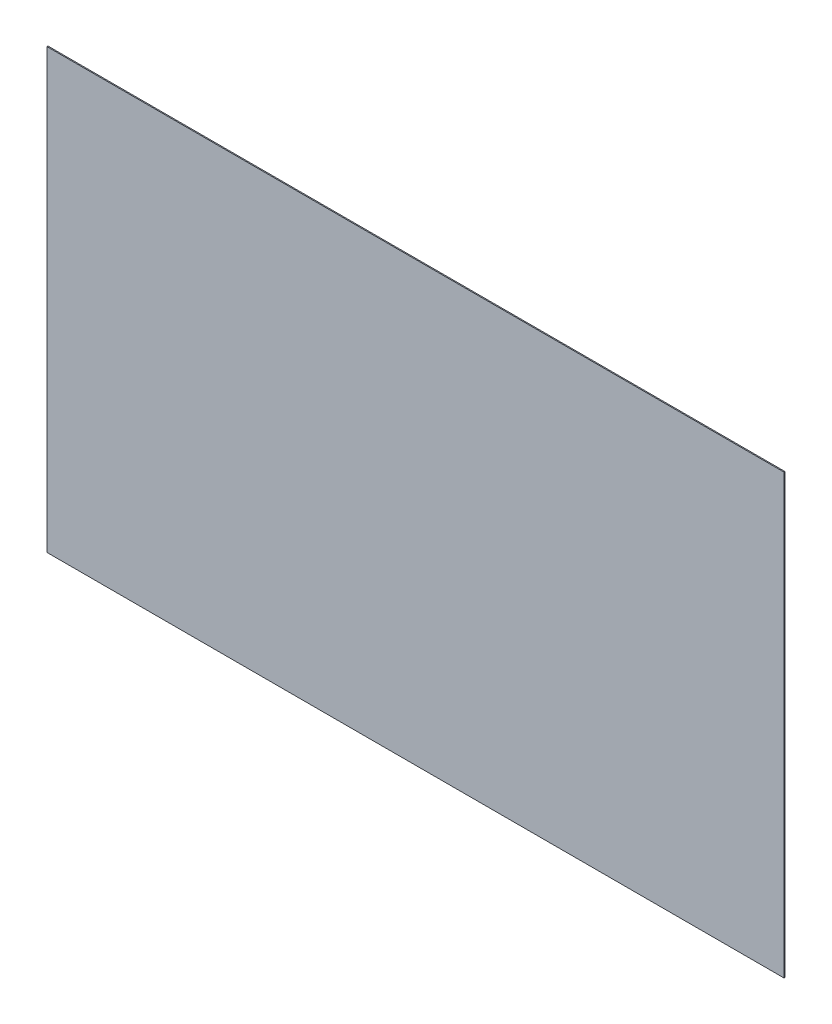
ISO-10303-21;
HEADER;
FILE_DESCRIPTION(('STEP AP214'),'2;1');
FILE_NAME('part.step','',(''),(''),'','','');
FILE_SCHEMA(('AUTOMOTIVE_DESIGN { 1 0 10303 214 1 1 1 1 }'));
ENDSEC;
DATA;
#1=APPLICATION_CONTEXT('core data for automotive mechanical design processes');
#2=APPLICATION_PROTOCOL_DEFINITION('international standard','automotive_design',2000,#1);
#3=PRODUCT_CONTEXT('',#1,'mechanical');
#4=PRODUCT('Part','Part','',(#3));
#5=PRODUCT_RELATED_PRODUCT_CATEGORY('part','',(#4));
#6=PRODUCT_DEFINITION_FORMATION('','',#4);
#7=PRODUCT_DEFINITION_CONTEXT('part definition',#1,'design');
#8=PRODUCT_DEFINITION('design','',#6,#7);
#9=PRODUCT_DEFINITION_SHAPE('','',#8);
#10=(LENGTH_UNIT() NAMED_UNIT(*) SI_UNIT(.MILLI.,.METRE.));
#11=(NAMED_UNIT(*) PLANE_ANGLE_UNIT() SI_UNIT($,.RADIAN.));
#12=(NAMED_UNIT(*) SI_UNIT($,.STERADIAN.) SOLID_ANGLE_UNIT());
#13=UNCERTAINTY_MEASURE_WITH_UNIT(LENGTH_MEASURE(1.E-05),#10,'distance_accuracy_value','');
#14=(GEOMETRIC_REPRESENTATION_CONTEXT(3) GLOBAL_UNCERTAINTY_ASSIGNED_CONTEXT((#13)) GLOBAL_UNIT_ASSIGNED_CONTEXT((#10,
#11,#12)) REPRESENTATION_CONTEXT('',''));
#15=CARTESIAN_POINT('',(0.,0.,0.));
#16=DIRECTION('',(0.,0.,1.));
#17=DIRECTION('',(1.,0.,0.));
#18=AXIS2_PLACEMENT_3D('',#15,#16,#17);
#19=CARTESIAN_POINT('',(-32.5000000000001,-31.2,0.1));
#20=DIRECTION('',(1.,0.,0.));
#21=DIRECTION('',(0.,0.,-1.));
#22=AXIS2_PLACEMENT_3D('',#19,#20,#21);
#23=PLANE('',#22);
#24=DIRECTION('',(0.,-1.,0.));
#25=VECTOR('',#24,1.);
#26=CARTESIAN_POINT('',(-32.5000000000001,-31.2,0.));
#27=LINE('',#26,#25);
#28=CARTESIAN_POINT('',(-32.5000000000001,11.3,0.));
#29=VERTEX_POINT('',#28);
#30=CARTESIAN_POINT('',(-32.5000000000001,-31.2,0.));
#31=VERTEX_POINT('',#30);
#32=EDGE_CURVE('E104',#29,#31,#27,.T.);
#33=ORIENTED_EDGE('',*,*,#32,.T.);
#34=DIRECTION('',(0.,0.,-1.));
#35=VECTOR('',#34,1.);
#36=CARTESIAN_POINT('',(-32.5000000000001,-31.2,0.1));
#37=LINE('',#36,#35);
#38=CARTESIAN_POINT('',(-32.5000000000001,-31.2,0.1));
#39=VERTEX_POINT('',#38);
#40=EDGE_CURVE('E11',#39,#31,#37,.T.);
#41=ORIENTED_EDGE('',*,*,#40,.F.);
#42=DIRECTION('',(0.,-1.,0.));
#43=VECTOR('',#42,1.);
#44=CARTESIAN_POINT('',(-32.5000000000001,-31.2,0.1));
#45=LINE('',#44,#43);
#46=CARTESIAN_POINT('',(-32.5000000000001,11.3,0.1));
#47=VERTEX_POINT('',#46);
#48=EDGE_CURVE('E92',#47,#39,#45,.T.);
#49=ORIENTED_EDGE('',*,*,#48,.F.);
#50=DIRECTION('',(0.,0.,-1.));
#51=VECTOR('',#50,1.);
#52=CARTESIAN_POINT('',(-32.5000000000001,11.3,0.1));
#53=LINE('',#52,#51);
#54=EDGE_CURVE('E100',#47,#29,#53,.T.);
#55=ORIENTED_EDGE('',*,*,#54,.T.);
#56=EDGE_LOOP('',(#33,#41,#49,#55));
#57=FACE_BOUND('',#56,.T.);
#58=ADVANCED_FACE('F41',(#57),#23,.F.);
#59=CARTESIAN_POINT('',(-32.5000000000001,-31.2,0.1));
#60=DIRECTION('',(0.,1.,0.));
#61=DIRECTION('',(0.,0.,1.));
#62=AXIS2_PLACEMENT_3D('',#59,#60,#61);
#63=PLANE('',#62);
#64=DIRECTION('',(1.,0.,0.));
#65=VECTOR('',#64,1.);
#66=CARTESIAN_POINT('',(-32.5000000000001,-31.2,0.));
#67=LINE('',#66,#65);
#68=CARTESIAN_POINT('',(38.9999999999999,-31.2,0.));
#69=VERTEX_POINT('',#68);
#70=EDGE_CURVE('E96',#31,#69,#67,.T.);
#71=ORIENTED_EDGE('',*,*,#70,.T.);
#72=DIRECTION('',(0.,0.,-1.));
#73=VECTOR('',#72,1.);
#74=CARTESIAN_POINT('',(38.9999999999999,-31.2,0.1));
#75=LINE('',#74,#73);
#76=CARTESIAN_POINT('',(38.9999999999999,-31.2,0.1));
#77=VERTEX_POINT('',#76);
#78=EDGE_CURVE('E49',#77,#69,#75,.T.);
#79=ORIENTED_EDGE('',*,*,#78,.F.);
#80=DIRECTION('',(1.,0.,0.));
#81=VECTOR('',#80,1.);
#82=CARTESIAN_POINT('',(-32.5000000000001,-31.2,0.1));
#83=LINE('',#82,#81);
#84=EDGE_CURVE('E87',#39,#77,#83,.T.);
#85=ORIENTED_EDGE('',*,*,#84,.F.);
#86=ORIENTED_EDGE('',*,*,#40,.T.);
#87=EDGE_LOOP('',(#71,#79,#85,#86));
#88=FACE_BOUND('',#87,.T.);
#89=ADVANCED_FACE('F95',(#88),#63,.F.);
#90=CARTESIAN_POINT('',(38.9999999999999,-31.2,0.1));
#91=DIRECTION('',(-1.,0.,0.));
#92=DIRECTION('',(0.,0.,1.));
#93=AXIS2_PLACEMENT_3D('',#90,#91,#92);
#94=PLANE('',#93);
#95=DIRECTION('',(0.,1.,0.));
#96=VECTOR('',#95,1.);
#97=CARTESIAN_POINT('',(38.9999999999999,-31.2,0.));
#98=LINE('',#97,#96);
#99=CARTESIAN_POINT('',(38.9999999999999,11.3,0.));
#100=VERTEX_POINT('',#99);
#101=EDGE_CURVE('E74',#69,#100,#98,.T.);
#102=ORIENTED_EDGE('',*,*,#101,.T.);
#103=DIRECTION('',(0.,0.,-1.));
#104=VECTOR('',#103,1.);
#105=CARTESIAN_POINT('',(38.9999999999999,11.3,0.1));
#106=LINE('',#105,#104);
#107=CARTESIAN_POINT('',(38.9999999999999,11.3,0.1));
#108=VERTEX_POINT('',#107);
#109=EDGE_CURVE('E97',#108,#100,#106,.T.);
#110=ORIENTED_EDGE('',*,*,#109,.F.);
#111=DIRECTION('',(0.,1.,0.));
#112=VECTOR('',#111,1.);
#113=CARTESIAN_POINT('',(38.9999999999999,-31.2,0.1));
#114=LINE('',#113,#112);
#115=EDGE_CURVE('E90',#77,#108,#114,.T.);
#116=ORIENTED_EDGE('',*,*,#115,.F.);
#117=ORIENTED_EDGE('',*,*,#78,.T.);
#118=EDGE_LOOP('',(#102,#110,#116,#117));
#119=FACE_BOUND('',#118,.T.);
#120=ADVANCED_FACE('F98',(#119),#94,.F.);
#121=CARTESIAN_POINT('',(-32.5000000000001,11.3,0.1));
#122=DIRECTION('',(0.,-1.,0.));
#123=DIRECTION('',(0.,0.,-1.));
#124=AXIS2_PLACEMENT_3D('',#121,#122,#123);
#125=PLANE('',#124);
#126=DIRECTION('',(-1.,0.,0.));
#127=VECTOR('',#126,1.);
#128=CARTESIAN_POINT('',(-32.5000000000001,11.3,0.));
#129=LINE('',#128,#127);
#130=EDGE_CURVE('E80',#100,#29,#129,.T.);
#131=ORIENTED_EDGE('',*,*,#130,.T.);
#132=ORIENTED_EDGE('',*,*,#54,.F.);
#133=DIRECTION('',(-1.,0.,0.));
#134=VECTOR('',#133,1.);
#135=CARTESIAN_POINT('',(-32.5000000000001,11.3,0.1));
#136=LINE('',#135,#134);
#137=EDGE_CURVE('E57',#108,#47,#136,.T.);
#138=ORIENTED_EDGE('',*,*,#137,.F.);
#139=ORIENTED_EDGE('',*,*,#109,.T.);
#140=EDGE_LOOP('',(#131,#132,#138,#139));
#141=FACE_BOUND('',#140,.T.);
#142=ADVANCED_FACE('F111',(#141),#125,.F.);
#143=CARTESIAN_POINT('',(-32.5000000000001,11.3,0.1));
#144=DIRECTION('',(0.,0.,-1.));
#145=DIRECTION('',(-1.,0.,0.));
#146=AXIS2_PLACEMENT_3D('',#143,#144,#145);
#147=PLANE('',#146);
#148=ORIENTED_EDGE('',*,*,#48,.T.);
#149=ORIENTED_EDGE('',*,*,#84,.T.);
#150=ORIENTED_EDGE('',*,*,#115,.T.);
#151=ORIENTED_EDGE('',*,*,#137,.T.);
#152=EDGE_LOOP('',(#148,#149,#150,#151));
#153=FACE_BOUND('',#152,.T.);
#154=ADVANCED_FACE('F88',(#153),#147,.F.);
#155=CARTESIAN_POINT('',(-32.5000000000001,11.3,0.));
#156=DIRECTION('',(0.,0.,-1.));
#157=DIRECTION('',(-1.,0.,0.));
#158=AXIS2_PLACEMENT_3D('',#155,#156,#157);
#159=PLANE('',#158);
#160=ORIENTED_EDGE('',*,*,#32,.F.);
#161=ORIENTED_EDGE('',*,*,#130,.F.);
#162=ORIENTED_EDGE('',*,*,#101,.F.);
#163=ORIENTED_EDGE('',*,*,#70,.F.);
#164=EDGE_LOOP('',(#160,#161,#162,#163));
#165=FACE_BOUND('',#164,.T.);
#166=ADVANCED_FACE('F114',(#165),#159,.T.);
#167=CLOSED_SHELL('',(#58,#89,#120,#142,#154,#166));
#168=MANIFOLD_SOLID_BREP('B2',#167);
#169=ADVANCED_BREP_SHAPE_REPRESENTATION('',(#18,#168),#14);
#170=SHAPE_DEFINITION_REPRESENTATION(#9,#169);
ENDSEC;
END-ISO-10303-21;
